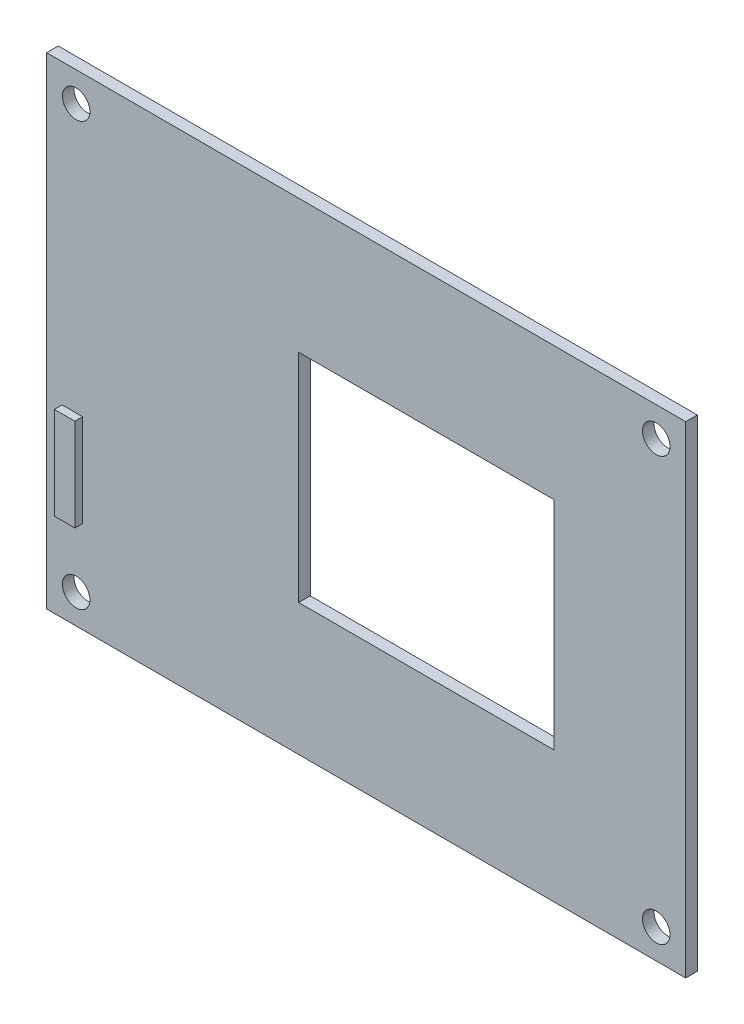
ISO-10303-21;
HEADER;
FILE_DESCRIPTION(('STEP AP214'),'2;1');
FILE_NAME('part.step','',(''),(''),'','','');
FILE_SCHEMA(('AUTOMOTIVE_DESIGN { 1 0 10303 214 1 1 1 1 }'));
ENDSEC;
DATA;
#1=APPLICATION_CONTEXT('core data for automotive mechanical design processes');
#2=APPLICATION_PROTOCOL_DEFINITION('international standard','automotive_design',2000,#1);
#3=PRODUCT_CONTEXT('',#1,'mechanical');
#4=PRODUCT('Part','Part','',(#3));
#5=PRODUCT_RELATED_PRODUCT_CATEGORY('part','',(#4));
#6=PRODUCT_DEFINITION_FORMATION('','',#4);
#7=PRODUCT_DEFINITION_CONTEXT('part definition',#1,'design');
#8=PRODUCT_DEFINITION('design','',#6,#7);
#9=PRODUCT_DEFINITION_SHAPE('','',#8);
#10=(LENGTH_UNIT() NAMED_UNIT(*) SI_UNIT(.MILLI.,.METRE.));
#11=(NAMED_UNIT(*) PLANE_ANGLE_UNIT() SI_UNIT($,.RADIAN.));
#12=(NAMED_UNIT(*) SI_UNIT($,.STERADIAN.) SOLID_ANGLE_UNIT());
#13=UNCERTAINTY_MEASURE_WITH_UNIT(LENGTH_MEASURE(1.E-05),#10,'distance_accuracy_value','');
#14=(GEOMETRIC_REPRESENTATION_CONTEXT(3) GLOBAL_UNCERTAINTY_ASSIGNED_CONTEXT((#13)) GLOBAL_UNIT_ASSIGNED_CONTEXT((#10,
#11,#12)) REPRESENTATION_CONTEXT('',''));
#15=CARTESIAN_POINT('',(0.,0.,0.));
#16=DIRECTION('',(0.,0.,1.));
#17=DIRECTION('',(1.,0.,0.));
#18=AXIS2_PLACEMENT_3D('',#15,#16,#17);
#19=CARTESIAN_POINT('',(0.,0.,0.));
#20=DIRECTION('',(0.,0.,-1.));
#21=DIRECTION('',(-1.,0.,0.));
#22=AXIS2_PLACEMENT_3D('',#19,#20,#21);
#23=PLANE('',#22);
#24=CARTESIAN_POINT('',(78.74,3.81,0.));
#25=DIRECTION('',(0.,0.,1.));
#26=DIRECTION('',(1.,0.,0.));
#27=AXIS2_PLACEMENT_3D('',#24,#25,#26);
#28=CIRCLE('',#27,1.77800000000001);
#29=CARTESIAN_POINT('',(80.518,3.81,0.));
#30=VERTEX_POINT('',#29);
#31=EDGE_CURVE('E242',#30,#30,#28,.T.);
#32=ORIENTED_EDGE('',*,*,#31,.T.);
#33=EDGE_LOOP('',(#32));
#34=FACE_BOUND('',#33,.T.);
#35=CARTESIAN_POINT('',(3.81,58.42,0.));
#36=DIRECTION('',(0.,0.,1.));
#37=DIRECTION('',(1.,0.,0.));
#38=AXIS2_PLACEMENT_3D('',#35,#36,#37);
#39=CIRCLE('',#38,1.778);
#40=CARTESIAN_POINT('',(5.588,58.42,0.));
#41=VERTEX_POINT('',#40);
#42=EDGE_CURVE('E254',#41,#41,#39,.T.);
#43=ORIENTED_EDGE('',*,*,#42,.T.);
#44=EDGE_LOOP('',(#43));
#45=FACE_BOUND('',#44,.T.);
#46=DIRECTION('',(0.,-1.,0.));
#47=VECTOR('',#46,1.);
#48=CARTESIAN_POINT('',(0.,0.,0.));
#49=LINE('',#48,#47);
#50=CARTESIAN_POINT('',(0.,62.23,0.));
#51=VERTEX_POINT('',#50);
#52=CARTESIAN_POINT('',(0.,0.,0.));
#53=VERTEX_POINT('',#52);
#54=EDGE_CURVE('E260',#51,#53,#49,.T.);
#55=ORIENTED_EDGE('',*,*,#54,.F.);
#56=DIRECTION('',(-1.,0.,0.));
#57=VECTOR('',#56,1.);
#58=CARTESIAN_POINT('',(0.,62.23,0.));
#59=LINE('',#58,#57);
#60=CARTESIAN_POINT('',(82.55,62.23,0.));
#61=VERTEX_POINT('',#60);
#62=EDGE_CURVE('E267',#61,#51,#59,.T.);
#63=ORIENTED_EDGE('',*,*,#62,.F.);
#64=DIRECTION('',(0.,1.,0.));
#65=VECTOR('',#64,1.);
#66=CARTESIAN_POINT('',(82.55,0.,0.));
#67=LINE('',#66,#65);
#68=CARTESIAN_POINT('',(82.55,0.,0.));
#69=VERTEX_POINT('',#68);
#70=EDGE_CURVE('E278',#69,#61,#67,.T.);
#71=ORIENTED_EDGE('',*,*,#70,.F.);
#72=DIRECTION('',(1.,0.,0.));
#73=VECTOR('',#72,1.);
#74=CARTESIAN_POINT('',(0.,0.,0.));
#75=LINE('',#74,#73);
#76=EDGE_CURVE('E276',#53,#69,#75,.T.);
#77=ORIENTED_EDGE('',*,*,#76,.F.);
#78=EDGE_LOOP('',(#55,#63,#71,#77));
#79=FACE_BOUND('',#78,.T.);
#80=CARTESIAN_POINT('',(78.74,58.42,0.));
#81=DIRECTION('',(0.,0.,1.));
#82=DIRECTION('',(1.,0.,0.));
#83=AXIS2_PLACEMENT_3D('',#80,#81,#82);
#84=CIRCLE('',#83,1.77800000000001);
#85=CARTESIAN_POINT('',(80.518,58.42,0.));
#86=VERTEX_POINT('',#85);
#87=EDGE_CURVE('E248',#86,#86,#84,.T.);
#88=ORIENTED_EDGE('',*,*,#87,.T.);
#89=EDGE_LOOP('',(#88));
#90=FACE_BOUND('',#89,.T.);
#91=CARTESIAN_POINT('',(3.81000000000001,3.80999999999999,0.));
#92=DIRECTION('',(0.,0.,1.));
#93=DIRECTION('',(1.,0.,0.));
#94=AXIS2_PLACEMENT_3D('',#91,#92,#93);
#95=CIRCLE('',#94,1.77799999999999);
#96=CARTESIAN_POINT('',(5.588,3.80999999999999,0.));
#97=VERTEX_POINT('',#96);
#98=EDGE_CURVE('E238',#97,#97,#95,.T.);
#99=ORIENTED_EDGE('',*,*,#98,.T.);
#100=EDGE_LOOP('',(#99));
#101=FACE_BOUND('',#100,.T.);
#102=DIRECTION('',(-1.,0.,0.));
#103=VECTOR('',#102,1.);
#104=CARTESIAN_POINT('',(32.55,45.,0.));
#105=LINE('',#104,#103);
#106=CARTESIAN_POINT('',(65.55,45.,0.));
#107=VERTEX_POINT('',#106);
#108=CARTESIAN_POINT('',(32.55,45.,0.));
#109=VERTEX_POINT('',#108);
#110=EDGE_CURVE('E211',#107,#109,#105,.T.);
#111=ORIENTED_EDGE('',*,*,#110,.T.);
#112=DIRECTION('',(0.,-1.,0.));
#113=VECTOR('',#112,1.);
#114=CARTESIAN_POINT('',(32.55,45.,0.));
#115=LINE('',#114,#113);
#116=CARTESIAN_POINT('',(32.55,17.,0.));
#117=VERTEX_POINT('',#116);
#118=EDGE_CURVE('E207',#109,#117,#115,.T.);
#119=ORIENTED_EDGE('',*,*,#118,.T.);
#120=DIRECTION('',(1.,0.,0.));
#121=VECTOR('',#120,1.);
#122=CARTESIAN_POINT('',(32.55,17.,0.));
#123=LINE('',#122,#121);
#124=CARTESIAN_POINT('',(65.55,17.,0.));
#125=VERTEX_POINT('',#124);
#126=EDGE_CURVE('E221',#117,#125,#123,.T.);
#127=ORIENTED_EDGE('',*,*,#126,.T.);
#128=DIRECTION('',(0.,1.,0.));
#129=VECTOR('',#128,1.);
#130=CARTESIAN_POINT('',(65.55,45.,0.));
#131=LINE('',#130,#129);
#132=EDGE_CURVE('E224',#125,#107,#131,.T.);
#133=ORIENTED_EDGE('',*,*,#132,.T.);
#134=EDGE_LOOP('',(#111,#119,#127,#133));
#135=FACE_BOUND('',#134,.T.);
#136=DIRECTION('',(1.,0.,0.));
#137=VECTOR('',#136,1.);
#138=CARTESIAN_POINT('',(4.,37.7423110963258,0.));
#139=LINE('',#138,#137);
#140=CARTESIAN_POINT('',(4.,37.7423110963258,0.));
#141=VERTEX_POINT('',#140);
#142=CARTESIAN_POINT('',(11.04365484836,37.7423110963258,0.));
#143=VERTEX_POINT('',#142);
#144=EDGE_CURVE('E538',#141,#143,#139,.T.);
#145=ORIENTED_EDGE('',*,*,#144,.F.);
#146=DIRECTION('',(0.,1.,0.));
#147=VECTOR('',#146,1.);
#148=CARTESIAN_POINT('',(4.,37.7423110963258,0.));
#149=LINE('',#148,#147);
#150=CARTESIAN_POINT('',(4.,27.3395934441702,0.));
#151=VERTEX_POINT('',#150);
#152=EDGE_CURVE('E171',#151,#141,#149,.T.);
#153=ORIENTED_EDGE('',*,*,#152,.F.);
#154=DIRECTION('',(-1.,0.,0.));
#155=VECTOR('',#154,1.);
#156=CARTESIAN_POINT('',(4.,27.3395934441702,0.));
#157=LINE('',#156,#155);
#158=CARTESIAN_POINT('',(11.04365484836,27.3395934441702,0.));
#159=VERTEX_POINT('',#158);
#160=EDGE_CURVE('E167',#159,#151,#157,.T.);
#161=ORIENTED_EDGE('',*,*,#160,.F.);
#162=DIRECTION('',(0.,-1.,0.));
#163=VECTOR('',#162,1.);
#164=CARTESIAN_POINT('',(11.04365484836,37.7423110963258,0.));
#165=LINE('',#164,#163);
#166=EDGE_CURVE('E535',#143,#159,#165,.T.);
#167=ORIENTED_EDGE('',*,*,#166,.F.);
#168=EDGE_LOOP('',(#145,#153,#161,#167));
#169=FACE_BOUND('',#168,.T.);
#170=ADVANCED_FACE('F35',(#34,#45,#79,#90,#101,#135,#169),#23,.T.);
#171=CARTESIAN_POINT('',(0.,0.,1.5));
#172=DIRECTION('',(0.,0.,-1.));
#173=DIRECTION('',(-1.,0.,0.));
#174=AXIS2_PLACEMENT_3D('',#171,#172,#173);
#175=PLANE('',#174);
#176=DIRECTION('',(0.,-1.,0.));
#177=VECTOR('',#176,1.);
#178=CARTESIAN_POINT('',(32.55,45.,1.5));
#179=LINE('',#178,#177);
#180=CARTESIAN_POINT('',(32.55,45.,1.5));
#181=VERTEX_POINT('',#180);
#182=CARTESIAN_POINT('',(32.55,17.,1.5));
#183=VERTEX_POINT('',#182);
#184=EDGE_CURVE('E208',#181,#183,#179,.T.);
#185=ORIENTED_EDGE('',*,*,#184,.F.);
#186=DIRECTION('',(-1.,0.,0.));
#187=VECTOR('',#186,1.);
#188=CARTESIAN_POINT('',(32.55,45.,1.5));
#189=LINE('',#188,#187);
#190=CARTESIAN_POINT('',(65.55,45.,1.5));
#191=VERTEX_POINT('',#190);
#192=EDGE_CURVE('E216',#191,#181,#189,.T.);
#193=ORIENTED_EDGE('',*,*,#192,.F.);
#194=DIRECTION('',(0.,1.,0.));
#195=VECTOR('',#194,1.);
#196=CARTESIAN_POINT('',(65.55,45.,1.5));
#197=LINE('',#196,#195);
#198=CARTESIAN_POINT('',(65.55,17.,1.5));
#199=VERTEX_POINT('',#198);
#200=EDGE_CURVE('E213',#199,#191,#197,.T.);
#201=ORIENTED_EDGE('',*,*,#200,.F.);
#202=DIRECTION('',(1.,0.,0.));
#203=VECTOR('',#202,1.);
#204=CARTESIAN_POINT('',(32.55,17.,1.5));
#205=LINE('',#204,#203);
#206=EDGE_CURVE('E210',#183,#199,#205,.T.);
#207=ORIENTED_EDGE('',*,*,#206,.F.);
#208=EDGE_LOOP('',(#185,#193,#201,#207));
#209=FACE_BOUND('',#208,.T.);
#210=DIRECTION('',(0.,-1.,0.));
#211=VECTOR('',#210,1.);
#212=CARTESIAN_POINT('',(0.,0.,1.5));
#213=LINE('',#212,#211);
#214=CARTESIAN_POINT('',(0.,62.23,1.5));
#215=VERTEX_POINT('',#214);
#216=CARTESIAN_POINT('',(0.,0.,1.5));
#217=VERTEX_POINT('',#216);
#218=EDGE_CURVE('E263',#215,#217,#213,.T.);
#219=ORIENTED_EDGE('',*,*,#218,.T.);
#220=DIRECTION('',(1.,0.,0.));
#221=VECTOR('',#220,1.);
#222=CARTESIAN_POINT('',(0.,0.,1.5));
#223=LINE('',#222,#221);
#224=CARTESIAN_POINT('',(82.55,0.,1.5));
#225=VERTEX_POINT('',#224);
#226=EDGE_CURVE('E266',#217,#225,#223,.T.);
#227=ORIENTED_EDGE('',*,*,#226,.T.);
#228=DIRECTION('',(0.,1.,0.));
#229=VECTOR('',#228,1.);
#230=CARTESIAN_POINT('',(82.55,0.,1.5));
#231=LINE('',#230,#229);
#232=CARTESIAN_POINT('',(82.55,62.23,1.5));
#233=VERTEX_POINT('',#232);
#234=EDGE_CURVE('E269',#225,#233,#231,.T.);
#235=ORIENTED_EDGE('',*,*,#234,.T.);
#236=DIRECTION('',(-1.,0.,0.));
#237=VECTOR('',#236,1.);
#238=CARTESIAN_POINT('',(0.,62.23,1.5));
#239=LINE('',#238,#237);
#240=EDGE_CURVE('E271',#233,#215,#239,.T.);
#241=ORIENTED_EDGE('',*,*,#240,.T.);
#242=EDGE_LOOP('',(#219,#227,#235,#241));
#243=FACE_BOUND('',#242,.T.);
#244=CARTESIAN_POINT('',(3.81,58.42,1.5));
#245=DIRECTION('',(0.,0.,1.));
#246=DIRECTION('',(1.,0.,0.));
#247=AXIS2_PLACEMENT_3D('',#244,#245,#246);
#248=CIRCLE('',#247,1.778);
#249=CARTESIAN_POINT('',(5.588,58.42,1.5));
#250=VERTEX_POINT('',#249);
#251=EDGE_CURVE('E257',#250,#250,#248,.T.);
#252=ORIENTED_EDGE('',*,*,#251,.F.);
#253=EDGE_LOOP('',(#252));
#254=FACE_BOUND('',#253,.T.);
#255=CARTESIAN_POINT('',(78.74,58.42,1.5));
#256=DIRECTION('',(0.,0.,1.));
#257=DIRECTION('',(1.,0.,0.));
#258=AXIS2_PLACEMENT_3D('',#255,#256,#257);
#259=CIRCLE('',#258,1.77800000000001);
#260=CARTESIAN_POINT('',(80.518,58.42,1.5));
#261=VERTEX_POINT('',#260);
#262=EDGE_CURVE('E251',#261,#261,#259,.T.);
#263=ORIENTED_EDGE('',*,*,#262,.F.);
#264=EDGE_LOOP('',(#263));
#265=FACE_BOUND('',#264,.T.);
#266=CARTESIAN_POINT('',(78.74,3.81,1.5));
#267=DIRECTION('',(0.,0.,1.));
#268=DIRECTION('',(1.,0.,0.));
#269=AXIS2_PLACEMENT_3D('',#266,#267,#268);
#270=CIRCLE('',#269,1.77800000000001);
#271=CARTESIAN_POINT('',(80.518,3.81,1.5));
#272=VERTEX_POINT('',#271);
#273=EDGE_CURVE('E245',#272,#272,#270,.T.);
#274=ORIENTED_EDGE('',*,*,#273,.F.);
#275=EDGE_LOOP('',(#274));
#276=FACE_BOUND('',#275,.T.);
#277=CARTESIAN_POINT('',(3.81000000000001,3.80999999999999,1.5));
#278=DIRECTION('',(0.,0.,1.));
#279=DIRECTION('',(1.,0.,0.));
#280=AXIS2_PLACEMENT_3D('',#277,#278,#279);
#281=CIRCLE('',#280,1.77799999999999);
#282=CARTESIAN_POINT('',(5.588,3.80999999999999,1.5));
#283=VERTEX_POINT('',#282);
#284=EDGE_CURVE('E239',#283,#283,#281,.T.);
#285=ORIENTED_EDGE('',*,*,#284,.F.);
#286=EDGE_LOOP('',(#285));
#287=FACE_BOUND('',#286,.T.);
#288=DIRECTION('',(0.,-1.,0.));
#289=VECTOR('',#288,1.);
#290=CARTESIAN_POINT('',(2.,23.8303435860613,1.5));
#291=LINE('',#290,#289);
#292=CARTESIAN_POINT('',(2.,23.8303435860613,1.5));
#293=VERTEX_POINT('',#292);
#294=CARTESIAN_POINT('',(2.,11.8848586100365,1.5));
#295=VERTEX_POINT('',#294);
#296=EDGE_CURVE('E173',#293,#295,#291,.T.);
#297=ORIENTED_EDGE('',*,*,#296,.F.);
#298=DIRECTION('',(-1.,0.,0.));
#299=VECTOR('',#298,1.);
#300=CARTESIAN_POINT('',(2.,23.8303435860613,1.5));
#301=LINE('',#300,#299);
#302=CARTESIAN_POINT('',(4.64280641062496,23.8303435860613,1.5));
#303=VERTEX_POINT('',#302);
#304=EDGE_CURVE('E184',#303,#293,#301,.T.);
#305=ORIENTED_EDGE('',*,*,#304,.F.);
#306=DIRECTION('',(0.,1.,0.));
#307=VECTOR('',#306,1.);
#308=CARTESIAN_POINT('',(4.64280641062496,23.8303435860613,1.5));
#309=LINE('',#308,#307);
#310=CARTESIAN_POINT('',(4.64280641062496,11.8848586100365,1.5));
#311=VERTEX_POINT('',#310);
#312=EDGE_CURVE('E192',#311,#303,#309,.T.);
#313=ORIENTED_EDGE('',*,*,#312,.F.);
#314=DIRECTION('',(1.,0.,0.));
#315=VECTOR('',#314,1.);
#316=CARTESIAN_POINT('',(2.,11.8848586100365,1.5));
#317=LINE('',#316,#315);
#318=EDGE_CURVE('E58',#295,#311,#317,.T.);
#319=ORIENTED_EDGE('',*,*,#318,.F.);
#320=EDGE_LOOP('',(#297,#305,#313,#319));
#321=FACE_BOUND('',#320,.T.);
#322=ADVANCED_FACE('F305',(#209,#243,#254,#265,#276,#287,#321),#175,.F.);
#323=CARTESIAN_POINT('',(0.,0.,1.5));
#324=DIRECTION('',(1.,0.,0.));
#325=DIRECTION('',(0.,0.,-1.));
#326=AXIS2_PLACEMENT_3D('',#323,#324,#325);
#327=PLANE('',#326);
#328=ORIENTED_EDGE('',*,*,#54,.T.);
#329=DIRECTION('',(0.,0.,-1.));
#330=VECTOR('',#329,1.);
#331=CARTESIAN_POINT('',(0.,0.,1.5));
#332=LINE('',#331,#330);
#333=EDGE_CURVE('E11',#217,#53,#332,.T.);
#334=ORIENTED_EDGE('',*,*,#333,.F.);
#335=ORIENTED_EDGE('',*,*,#218,.F.);
#336=DIRECTION('',(0.,0.,-1.));
#337=VECTOR('',#336,1.);
#338=CARTESIAN_POINT('',(0.,62.23,1.5));
#339=LINE('',#338,#337);
#340=EDGE_CURVE('E273',#215,#51,#339,.T.);
#341=ORIENTED_EDGE('',*,*,#340,.T.);
#342=EDGE_LOOP('',(#328,#334,#335,#341));
#343=FACE_BOUND('',#342,.T.);
#344=ADVANCED_FACE('F37',(#343),#327,.F.);
#345=CARTESIAN_POINT('',(0.,0.,1.5));
#346=DIRECTION('',(0.,1.,0.));
#347=DIRECTION('',(0.,0.,1.));
#348=AXIS2_PLACEMENT_3D('',#345,#346,#347);
#349=PLANE('',#348);
#350=ORIENTED_EDGE('',*,*,#76,.T.);
#351=DIRECTION('',(0.,0.,-1.));
#352=VECTOR('',#351,1.);
#353=CARTESIAN_POINT('',(82.55,0.,1.5));
#354=LINE('',#353,#352);
#355=EDGE_CURVE('E43',#225,#69,#354,.T.);
#356=ORIENTED_EDGE('',*,*,#355,.F.);
#357=ORIENTED_EDGE('',*,*,#226,.F.);
#358=ORIENTED_EDGE('',*,*,#333,.T.);
#359=EDGE_LOOP('',(#350,#356,#357,#358));
#360=FACE_BOUND('',#359,.T.);
#361=ADVANCED_FACE('F307',(#360),#349,.F.);
#362=CARTESIAN_POINT('',(82.55,0.,1.5));
#363=DIRECTION('',(-1.,0.,0.));
#364=DIRECTION('',(0.,0.,1.));
#365=AXIS2_PLACEMENT_3D('',#362,#363,#364);
#366=PLANE('',#365);
#367=ORIENTED_EDGE('',*,*,#70,.T.);
#368=DIRECTION('',(0.,0.,-1.));
#369=VECTOR('',#368,1.);
#370=CARTESIAN_POINT('',(82.55,62.23,1.5));
#371=LINE('',#370,#369);
#372=EDGE_CURVE('E283',#233,#61,#371,.T.);
#373=ORIENTED_EDGE('',*,*,#372,.F.);
#374=ORIENTED_EDGE('',*,*,#234,.F.);
#375=ORIENTED_EDGE('',*,*,#355,.T.);
#376=EDGE_LOOP('',(#367,#373,#374,#375));
#377=FACE_BOUND('',#376,.T.);
#378=ADVANCED_FACE('F290',(#377),#366,.F.);
#379=CARTESIAN_POINT('',(0.,62.23,1.5));
#380=DIRECTION('',(0.,-1.,0.));
#381=DIRECTION('',(0.,0.,-1.));
#382=AXIS2_PLACEMENT_3D('',#379,#380,#381);
#383=PLANE('',#382);
#384=ORIENTED_EDGE('',*,*,#62,.T.);
#385=ORIENTED_EDGE('',*,*,#340,.F.);
#386=ORIENTED_EDGE('',*,*,#240,.F.);
#387=ORIENTED_EDGE('',*,*,#372,.T.);
#388=EDGE_LOOP('',(#384,#385,#386,#387));
#389=FACE_BOUND('',#388,.T.);
#390=ADVANCED_FACE('F299',(#389),#383,.F.);
#391=CARTESIAN_POINT('',(3.81,58.42,1.5));
#392=DIRECTION('',(0.,0.,-1.));
#393=DIRECTION('',(-1.,0.,0.));
#394=AXIS2_PLACEMENT_3D('',#391,#392,#393);
#395=CYLINDRICAL_SURFACE('',#394,1.778);
#396=ORIENTED_EDGE('',*,*,#251,.T.);
#397=EDGE_LOOP('',(#396));
#398=FACE_BOUND('',#397,.T.);
#399=ORIENTED_EDGE('',*,*,#42,.F.);
#400=EDGE_LOOP('',(#399));
#401=FACE_BOUND('',#400,.T.);
#402=ADVANCED_FACE('F326',(#398,#401),#395,.F.);
#403=CARTESIAN_POINT('',(78.74,58.42,1.5));
#404=DIRECTION('',(0.,0.,-1.));
#405=DIRECTION('',(-1.,0.,0.));
#406=AXIS2_PLACEMENT_3D('',#403,#404,#405);
#407=CYLINDRICAL_SURFACE('',#406,1.77800000000001);
#408=ORIENTED_EDGE('',*,*,#262,.T.);
#409=EDGE_LOOP('',(#408));
#410=FACE_BOUND('',#409,.T.);
#411=ORIENTED_EDGE('',*,*,#87,.F.);
#412=EDGE_LOOP('',(#411));
#413=FACE_BOUND('',#412,.T.);
#414=ADVANCED_FACE('F330',(#410,#413),#407,.F.);
#415=CARTESIAN_POINT('',(78.74,3.81,1.5));
#416=DIRECTION('',(0.,0.,-1.));
#417=DIRECTION('',(-1.,0.,0.));
#418=AXIS2_PLACEMENT_3D('',#415,#416,#417);
#419=CYLINDRICAL_SURFACE('',#418,1.77800000000001);
#420=ORIENTED_EDGE('',*,*,#273,.T.);
#421=EDGE_LOOP('',(#420));
#422=FACE_BOUND('',#421,.T.);
#423=ORIENTED_EDGE('',*,*,#31,.F.);
#424=EDGE_LOOP('',(#423));
#425=FACE_BOUND('',#424,.T.);
#426=ADVANCED_FACE('F335',(#422,#425),#419,.F.);
#427=CARTESIAN_POINT('',(3.81000000000001,3.80999999999999,1.5));
#428=DIRECTION('',(0.,0.,-1.));
#429=DIRECTION('',(-1.,0.,0.));
#430=AXIS2_PLACEMENT_3D('',#427,#428,#429);
#431=CYLINDRICAL_SURFACE('',#430,1.77799999999999);
#432=ORIENTED_EDGE('',*,*,#284,.T.);
#433=EDGE_LOOP('',(#432));
#434=FACE_BOUND('',#433,.T.);
#435=ORIENTED_EDGE('',*,*,#98,.F.);
#436=EDGE_LOOP('',(#435));
#437=FACE_BOUND('',#436,.T.);
#438=ADVANCED_FACE('F342',(#434,#437),#431,.F.);
#439=CARTESIAN_POINT('',(32.55,45.,1.5));
#440=DIRECTION('',(1.,0.,0.));
#441=DIRECTION('',(0.,0.,-1.));
#442=AXIS2_PLACEMENT_3D('',#439,#440,#441);
#443=PLANE('',#442);
#444=ORIENTED_EDGE('',*,*,#118,.F.);
#445=DIRECTION('',(0.,0.,-1.));
#446=VECTOR('',#445,1.);
#447=CARTESIAN_POINT('',(32.55,45.,1.5));
#448=LINE('',#447,#446);
#449=EDGE_CURVE('E218',#181,#109,#448,.T.);
#450=ORIENTED_EDGE('',*,*,#449,.F.);
#451=ORIENTED_EDGE('',*,*,#184,.T.);
#452=DIRECTION('',(0.,0.,-1.));
#453=VECTOR('',#452,1.);
#454=CARTESIAN_POINT('',(32.55,17.,1.5));
#455=LINE('',#454,#453);
#456=EDGE_CURVE('E235',#183,#117,#455,.T.);
#457=ORIENTED_EDGE('',*,*,#456,.T.);
#458=EDGE_LOOP('',(#444,#450,#451,#457));
#459=FACE_BOUND('',#458,.T.);
#460=ADVANCED_FACE('F346',(#459),#443,.T.);
#461=CARTESIAN_POINT('',(32.55,17.,1.5));
#462=DIRECTION('',(0.,1.,0.));
#463=DIRECTION('',(0.,0.,1.));
#464=AXIS2_PLACEMENT_3D('',#461,#462,#463);
#465=PLANE('',#464);
#466=ORIENTED_EDGE('',*,*,#126,.F.);
#467=ORIENTED_EDGE('',*,*,#456,.F.);
#468=ORIENTED_EDGE('',*,*,#206,.T.);
#469=DIRECTION('',(0.,0.,-1.));
#470=VECTOR('',#469,1.);
#471=CARTESIAN_POINT('',(65.55,17.,1.5));
#472=LINE('',#471,#470);
#473=EDGE_CURVE('E233',#199,#125,#472,.T.);
#474=ORIENTED_EDGE('',*,*,#473,.T.);
#475=EDGE_LOOP('',(#466,#467,#468,#474));
#476=FACE_BOUND('',#475,.T.);
#477=ADVANCED_FACE('F350',(#476),#465,.T.);
#478=CARTESIAN_POINT('',(65.55,45.,1.5));
#479=DIRECTION('',(-1.,0.,0.));
#480=DIRECTION('',(0.,0.,1.));
#481=AXIS2_PLACEMENT_3D('',#478,#479,#480);
#482=PLANE('',#481);
#483=ORIENTED_EDGE('',*,*,#132,.F.);
#484=ORIENTED_EDGE('',*,*,#473,.F.);
#485=ORIENTED_EDGE('',*,*,#200,.T.);
#486=DIRECTION('',(0.,0.,-1.));
#487=VECTOR('',#486,1.);
#488=CARTESIAN_POINT('',(65.55,45.,1.5));
#489=LINE('',#488,#487);
#490=EDGE_CURVE('E231',#191,#107,#489,.T.);
#491=ORIENTED_EDGE('',*,*,#490,.T.);
#492=EDGE_LOOP('',(#483,#484,#485,#491));
#493=FACE_BOUND('',#492,.T.);
#494=ADVANCED_FACE('F354',(#493),#482,.T.);
#495=CARTESIAN_POINT('',(32.55,45.,1.5));
#496=DIRECTION('',(0.,-1.,0.));
#497=DIRECTION('',(1.,0.,0.));
#498=AXIS2_PLACEMENT_3D('',#495,#496,#497);
#499=PLANE('',#498);
#500=ORIENTED_EDGE('',*,*,#110,.F.);
#501=ORIENTED_EDGE('',*,*,#490,.F.);
#502=ORIENTED_EDGE('',*,*,#192,.T.);
#503=ORIENTED_EDGE('',*,*,#449,.T.);
#504=EDGE_LOOP('',(#500,#501,#502,#503));
#505=FACE_BOUND('',#504,.T.);
#506=ADVANCED_FACE('F358',(#505),#499,.T.);
#507=CARTESIAN_POINT('',(2.,23.8303435860613,2.5));
#508=DIRECTION('',(1.,0.,0.));
#509=DIRECTION('',(0.,1.,0.));
#510=AXIS2_PLACEMENT_3D('',#507,#508,#509);
#511=PLANE('',#510);
#512=ORIENTED_EDGE('',*,*,#296,.T.);
#513=DIRECTION('',(0.,0.,-1.));
#514=VECTOR('',#513,1.);
#515=CARTESIAN_POINT('',(2.,11.8848586100365,2.5));
#516=LINE('',#515,#514);
#517=CARTESIAN_POINT('',(2.,11.8848586100365,2.5));
#518=VERTEX_POINT('',#517);
#519=EDGE_CURVE('E205',#518,#295,#516,.T.);
#520=ORIENTED_EDGE('',*,*,#519,.F.);
#521=DIRECTION('',(0.,-1.,0.));
#522=VECTOR('',#521,1.);
#523=CARTESIAN_POINT('',(2.,23.8303435860613,2.5));
#524=LINE('',#523,#522);
#525=CARTESIAN_POINT('',(2.,23.8303435860613,2.5));
#526=VERTEX_POINT('',#525);
#527=EDGE_CURVE('E180',#526,#518,#524,.T.);
#528=ORIENTED_EDGE('',*,*,#527,.F.);
#529=DIRECTION('',(0.,0.,-1.));
#530=VECTOR('',#529,1.);
#531=CARTESIAN_POINT('',(2.,23.8303435860613,2.5));
#532=LINE('',#531,#530);
#533=EDGE_CURVE('E189',#526,#293,#532,.T.);
#534=ORIENTED_EDGE('',*,*,#533,.T.);
#535=EDGE_LOOP('',(#512,#520,#528,#534));
#536=FACE_BOUND('',#535,.T.);
#537=ADVANCED_FACE('F362',(#536),#511,.F.);
#538=CARTESIAN_POINT('',(2.,11.8848586100365,2.5));
#539=DIRECTION('',(0.,1.,0.));
#540=DIRECTION('',(0.,0.,1.));
#541=AXIS2_PLACEMENT_3D('',#538,#539,#540);
#542=PLANE('',#541);
#543=ORIENTED_EDGE('',*,*,#318,.T.);
#544=DIRECTION('',(0.,0.,-1.));
#545=VECTOR('',#544,1.);
#546=CARTESIAN_POINT('',(4.64280641062496,11.8848586100365,2.5));
#547=LINE('',#546,#545);
#548=CARTESIAN_POINT('',(4.64280641062496,11.8848586100365,2.5));
#549=VERTEX_POINT('',#548);
#550=EDGE_CURVE('E202',#549,#311,#547,.T.);
#551=ORIENTED_EDGE('',*,*,#550,.F.);
#552=DIRECTION('',(1.,0.,0.));
#553=VECTOR('',#552,1.);
#554=CARTESIAN_POINT('',(2.,11.8848586100365,2.5));
#555=LINE('',#554,#553);
#556=EDGE_CURVE('E183',#518,#549,#555,.T.);
#557=ORIENTED_EDGE('',*,*,#556,.F.);
#558=ORIENTED_EDGE('',*,*,#519,.T.);
#559=EDGE_LOOP('',(#543,#551,#557,#558));
#560=FACE_BOUND('',#559,.T.);
#561=ADVANCED_FACE('F366',(#560),#542,.F.);
#562=CARTESIAN_POINT('',(4.64280641062496,23.8303435860613,2.5));
#563=DIRECTION('',(-1.,0.,0.));
#564=DIRECTION('',(0.,-1.,0.));
#565=AXIS2_PLACEMENT_3D('',#562,#563,#564);
#566=PLANE('',#565);
#567=ORIENTED_EDGE('',*,*,#312,.T.);
#568=DIRECTION('',(0.,0.,-1.));
#569=VECTOR('',#568,1.);
#570=CARTESIAN_POINT('',(4.64280641062496,23.8303435860613,2.5));
#571=LINE('',#570,#569);
#572=CARTESIAN_POINT('',(4.64280641062496,23.8303435860613,2.5));
#573=VERTEX_POINT('',#572);
#574=EDGE_CURVE('E199',#573,#303,#571,.T.);
#575=ORIENTED_EDGE('',*,*,#574,.F.);
#576=DIRECTION('',(0.,1.,0.));
#577=VECTOR('',#576,1.);
#578=CARTESIAN_POINT('',(4.64280641062496,23.8303435860613,2.5));
#579=LINE('',#578,#577);
#580=EDGE_CURVE('E186',#549,#573,#579,.T.);
#581=ORIENTED_EDGE('',*,*,#580,.F.);
#582=ORIENTED_EDGE('',*,*,#550,.T.);
#583=EDGE_LOOP('',(#567,#575,#581,#582));
#584=FACE_BOUND('',#583,.T.);
#585=ADVANCED_FACE('F370',(#584),#566,.F.);
#586=CARTESIAN_POINT('',(2.,23.8303435860613,2.5));
#587=DIRECTION('',(0.,-1.,0.));
#588=DIRECTION('',(0.,0.,-1.));
#589=AXIS2_PLACEMENT_3D('',#586,#587,#588);
#590=PLANE('',#589);
#591=ORIENTED_EDGE('',*,*,#304,.T.);
#592=ORIENTED_EDGE('',*,*,#533,.F.);
#593=DIRECTION('',(-1.,0.,0.));
#594=VECTOR('',#593,1.);
#595=CARTESIAN_POINT('',(2.,23.8303435860613,2.5));
#596=LINE('',#595,#594);
#597=EDGE_CURVE('E188',#573,#526,#596,.T.);
#598=ORIENTED_EDGE('',*,*,#597,.F.);
#599=ORIENTED_EDGE('',*,*,#574,.T.);
#600=EDGE_LOOP('',(#591,#592,#598,#599));
#601=FACE_BOUND('',#600,.T.);
#602=ADVANCED_FACE('F374',(#601),#590,.F.);
#603=CARTESIAN_POINT('',(0.,0.,2.5));
#604=DIRECTION('',(0.,0.,1.));
#605=DIRECTION('',(1.,0.,0.));
#606=AXIS2_PLACEMENT_3D('',#603,#604,#605);
#607=PLANE('',#606);
#608=ORIENTED_EDGE('',*,*,#527,.T.);
#609=ORIENTED_EDGE('',*,*,#556,.T.);
#610=ORIENTED_EDGE('',*,*,#580,.T.);
#611=ORIENTED_EDGE('',*,*,#597,.T.);
#612=EDGE_LOOP('',(#608,#609,#610,#611));
#613=FACE_BOUND('',#612,.T.);
#614=ADVANCED_FACE('F378',(#613),#607,.T.);
#615=CARTESIAN_POINT('',(4.,37.7423110963258,-2.));
#616=DIRECTION('',(1.,0.,0.));
#617=DIRECTION('',(0.,1.,0.));
#618=AXIS2_PLACEMENT_3D('',#615,#616,#617);
#619=PLANE('',#618);
#620=ORIENTED_EDGE('',*,*,#152,.T.);
#621=DIRECTION('',(0.,0.,1.));
#622=VECTOR('',#621,1.);
#623=CARTESIAN_POINT('',(4.,37.7423110963258,-2.));
#624=LINE('',#623,#622);
#625=CARTESIAN_POINT('',(4.,37.7423110963258,-2.));
#626=VERTEX_POINT('',#625);
#627=EDGE_CURVE('E152',#626,#141,#624,.T.);
#628=ORIENTED_EDGE('',*,*,#627,.F.);
#629=DIRECTION('',(0.,1.,0.));
#630=VECTOR('',#629,1.);
#631=CARTESIAN_POINT('',(4.,37.7423110963258,-2.));
#632=LINE('',#631,#630);
#633=CARTESIAN_POINT('',(4.,27.3395934441702,-2.));
#634=VERTEX_POINT('',#633);
#635=EDGE_CURVE('E159',#634,#626,#632,.T.);
#636=ORIENTED_EDGE('',*,*,#635,.F.);
#637=DIRECTION('',(0.,0.,1.));
#638=VECTOR('',#637,1.);
#639=CARTESIAN_POINT('',(4.,27.3395934441702,-2.));
#640=LINE('',#639,#638);
#641=EDGE_CURVE('E532',#634,#151,#640,.T.);
#642=ORIENTED_EDGE('',*,*,#641,.T.);
#643=EDGE_LOOP('',(#620,#628,#636,#642));
#644=FACE_BOUND('',#643,.T.);
#645=ADVANCED_FACE('F169',(#644),#619,.F.);
#646=CARTESIAN_POINT('',(4.,37.7423110963258,-2.));
#647=DIRECTION('',(0.,-1.,0.));
#648=DIRECTION('',(0.,0.,-1.));
#649=AXIS2_PLACEMENT_3D('',#646,#647,#648);
#650=PLANE('',#649);
#651=ORIENTED_EDGE('',*,*,#144,.T.);
#652=DIRECTION('',(0.,0.,1.));
#653=VECTOR('',#652,1.);
#654=CARTESIAN_POINT('',(11.04365484836,37.7423110963258,-2.));
#655=LINE('',#654,#653);
#656=CARTESIAN_POINT('',(11.04365484836,37.7423110963258,-2.));
#657=VERTEX_POINT('',#656);
#658=EDGE_CURVE('E155',#657,#143,#655,.T.);
#659=ORIENTED_EDGE('',*,*,#658,.F.);
#660=DIRECTION('',(1.,0.,0.));
#661=VECTOR('',#660,1.);
#662=CARTESIAN_POINT('',(4.,37.7423110963258,-2.));
#663=LINE('',#662,#661);
#664=EDGE_CURVE('E148',#626,#657,#663,.T.);
#665=ORIENTED_EDGE('',*,*,#664,.F.);
#666=ORIENTED_EDGE('',*,*,#627,.T.);
#667=EDGE_LOOP('',(#651,#659,#665,#666));
#668=FACE_BOUND('',#667,.T.);
#669=ADVANCED_FACE('F150',(#668),#650,.F.);
#670=CARTESIAN_POINT('',(11.04365484836,37.7423110963258,-2.));
#671=DIRECTION('',(-1.,0.,0.));
#672=DIRECTION('',(0.,-1.,0.));
#673=AXIS2_PLACEMENT_3D('',#670,#671,#672);
#674=PLANE('',#673);
#675=ORIENTED_EDGE('',*,*,#166,.T.);
#676=DIRECTION('',(0.,0.,1.));
#677=VECTOR('',#676,1.);
#678=CARTESIAN_POINT('',(11.04365484836,27.3395934441702,-2.));
#679=LINE('',#678,#677);
#680=CARTESIAN_POINT('',(11.04365484836,27.3395934441702,-2.));
#681=VERTEX_POINT('',#680);
#682=EDGE_CURVE('E50',#681,#159,#679,.T.);
#683=ORIENTED_EDGE('',*,*,#682,.F.);
#684=DIRECTION('',(0.,-1.,0.));
#685=VECTOR('',#684,1.);
#686=CARTESIAN_POINT('',(11.04365484836,37.7423110963258,-2.));
#687=LINE('',#686,#685);
#688=EDGE_CURVE('E158',#657,#681,#687,.T.);
#689=ORIENTED_EDGE('',*,*,#688,.F.);
#690=ORIENTED_EDGE('',*,*,#658,.T.);
#691=EDGE_LOOP('',(#675,#683,#689,#690));
#692=FACE_BOUND('',#691,.T.);
#693=ADVANCED_FACE('F387',(#692),#674,.F.);
#694=CARTESIAN_POINT('',(4.,27.3395934441702,-2.));
#695=DIRECTION('',(0.,1.,0.));
#696=DIRECTION('',(-1.,0.,0.));
#697=AXIS2_PLACEMENT_3D('',#694,#695,#696);
#698=PLANE('',#697);
#699=ORIENTED_EDGE('',*,*,#160,.T.);
#700=ORIENTED_EDGE('',*,*,#641,.F.);
#701=DIRECTION('',(-1.,0.,0.));
#702=VECTOR('',#701,1.);
#703=CARTESIAN_POINT('',(4.,27.3395934441702,-2.));
#704=LINE('',#703,#702);
#705=EDGE_CURVE('E163',#681,#634,#704,.T.);
#706=ORIENTED_EDGE('',*,*,#705,.F.);
#707=ORIENTED_EDGE('',*,*,#682,.T.);
#708=EDGE_LOOP('',(#699,#700,#706,#707));
#709=FACE_BOUND('',#708,.T.);
#710=ADVANCED_FACE('F390',(#709),#698,.F.);
#711=CARTESIAN_POINT('',(0.,0.,-2.));
#712=DIRECTION('',(0.,0.,1.));
#713=DIRECTION('',(1.,0.,0.));
#714=AXIS2_PLACEMENT_3D('',#711,#712,#713);
#715=PLANE('',#714);
#716=ORIENTED_EDGE('',*,*,#635,.T.);
#717=ORIENTED_EDGE('',*,*,#664,.T.);
#718=ORIENTED_EDGE('',*,*,#688,.T.);
#719=ORIENTED_EDGE('',*,*,#705,.T.);
#720=EDGE_LOOP('',(#716,#717,#718,#719));
#721=FACE_BOUND('',#720,.T.);
#722=ADVANCED_FACE('F162',(#721),#715,.F.);
#723=CLOSED_SHELL('',(#170,#322,#344,#361,#378,#390,#402,#414,#426,#438,#460,#477,#494,#506,
#537,#561,#585,#602,#614,#645,#669,#693,#710,#722));
#724=MANIFOLD_SOLID_BREP('B2',#723);
#725=ADVANCED_BREP_SHAPE_REPRESENTATION('',(#18,#724),#14);
#726=SHAPE_DEFINITION_REPRESENTATION(#9,#725);
ENDSEC;
END-ISO-10303-21;
